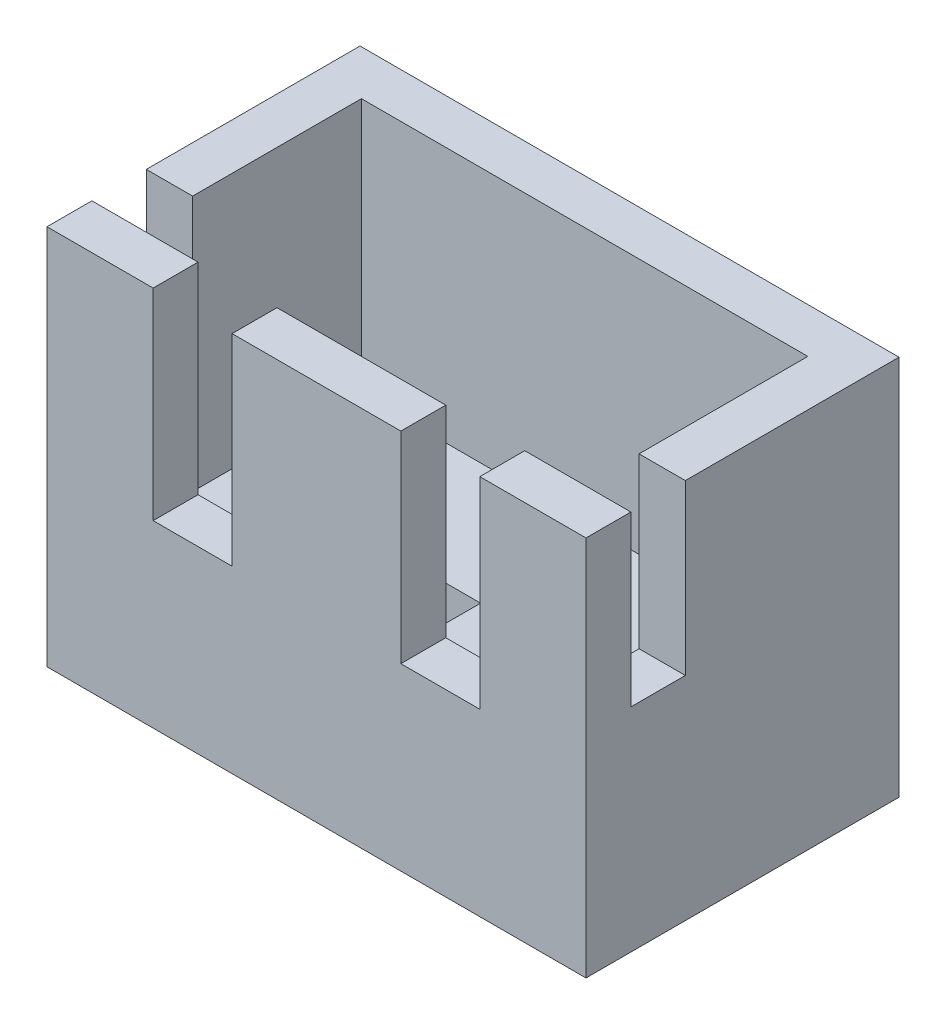
ISO-10303-21;
HEADER;
FILE_DESCRIPTION(('STEP AP214'),'2;1');
FILE_NAME('part.step','',(''),(''),'','','');
FILE_SCHEMA(('AUTOMOTIVE_DESIGN { 1 0 10303 214 1 1 1 1 }'));
ENDSEC;
DATA;
#1=APPLICATION_CONTEXT('core data for automotive mechanical design processes');
#2=APPLICATION_PROTOCOL_DEFINITION('international standard','automotive_design',2000,#1);
#3=PRODUCT_CONTEXT('',#1,'mechanical');
#4=PRODUCT('Part','Part','',(#3));
#5=PRODUCT_RELATED_PRODUCT_CATEGORY('part','',(#4));
#6=PRODUCT_DEFINITION_FORMATION('','',#4);
#7=PRODUCT_DEFINITION_CONTEXT('part definition',#1,'design');
#8=PRODUCT_DEFINITION('design','',#6,#7);
#9=PRODUCT_DEFINITION_SHAPE('','',#8);
#10=(LENGTH_UNIT() NAMED_UNIT(*) SI_UNIT(.MILLI.,.METRE.));
#11=(NAMED_UNIT(*) PLANE_ANGLE_UNIT() SI_UNIT($,.RADIAN.));
#12=(NAMED_UNIT(*) SI_UNIT($,.STERADIAN.) SOLID_ANGLE_UNIT());
#13=UNCERTAINTY_MEASURE_WITH_UNIT(LENGTH_MEASURE(1.E-05),#10,'distance_accuracy_value','');
#14=(GEOMETRIC_REPRESENTATION_CONTEXT(3) GLOBAL_UNCERTAINTY_ASSIGNED_CONTEXT((#13)) GLOBAL_UNIT_ASSIGNED_CONTEXT((#10,
#11,#12)) REPRESENTATION_CONTEXT('',''));
#15=CARTESIAN_POINT('',(0.,0.,0.));
#16=DIRECTION('',(0.,0.,1.));
#17=DIRECTION('',(1.,0.,0.));
#18=AXIS2_PLACEMENT_3D('',#15,#16,#17);
#19=CARTESIAN_POINT('',(2.82,-3.4,0.82));
#20=DIRECTION('',(1.,0.,0.));
#21=DIRECTION('',(0.,1.,0.));
#22=AXIS2_PLACEMENT_3D('',#19,#20,#21);
#23=PLANE('',#22);
#24=DIRECTION('',(0.,1.,0.));
#25=VECTOR('',#24,1.);
#26=CARTESIAN_POINT('',(2.82,-3.4,0.18));
#27=LINE('',#26,#25);
#28=CARTESIAN_POINT('',(2.82,0.,0.18));
#29=VERTEX_POINT('',#28);
#30=CARTESIAN_POINT('',(2.82,2.3,0.18));
#31=VERTEX_POINT('',#30);
#32=EDGE_CURVE('E11',#29,#31,#27,.T.);
#33=ORIENTED_EDGE('',*,*,#32,.F.);
#34=DIRECTION('',(0.,0.,-1.));
#35=VECTOR('',#34,1.);
#36=CARTESIAN_POINT('',(2.82,0.,0.82));
#37=LINE('',#36,#35);
#38=CARTESIAN_POINT('',(2.82,0.,0.82));
#39=VERTEX_POINT('',#38);
#40=EDGE_CURVE('E461',#39,#29,#37,.T.);
#41=ORIENTED_EDGE('',*,*,#40,.F.);
#42=DIRECTION('',(0.,1.,0.));
#43=VECTOR('',#42,1.);
#44=CARTESIAN_POINT('',(2.82,-3.4,0.82));
#45=LINE('',#44,#43);
#46=CARTESIAN_POINT('',(2.82,2.3,0.82));
#47=VERTEX_POINT('',#46);
#48=EDGE_CURVE('E681',#39,#47,#45,.T.);
#49=ORIENTED_EDGE('',*,*,#48,.T.);
#50=DIRECTION('',(0.,0.,1.));
#51=VECTOR('',#50,1.);
#52=CARTESIAN_POINT('',(2.82,2.3,0.82));
#53=LINE('',#52,#51);
#54=EDGE_CURVE('E637',#31,#47,#53,.T.);
#55=ORIENTED_EDGE('',*,*,#54,.F.);
#56=EDGE_LOOP('',(#33,#41,#49,#55));
#57=FACE_BOUND('',#56,.T.);
#58=ADVANCED_FACE('F17',(#57),#23,.F.);
#59=CARTESIAN_POINT('',(2.82,-3.4,0.18));
#60=DIRECTION('',(0.,0.,-1.));
#61=DIRECTION('',(-1.,0.,0.));
#62=AXIS2_PLACEMENT_3D('',#59,#60,#61);
#63=PLANE('',#62);
#64=DIRECTION('',(0.,1.,0.));
#65=VECTOR('',#64,1.);
#66=CARTESIAN_POINT('',(2.18,-3.4,0.18));
#67=LINE('',#66,#65);
#68=CARTESIAN_POINT('',(2.18,0.,0.18));
#69=VERTEX_POINT('',#68);
#70=CARTESIAN_POINT('',(2.18,2.3,0.18));
#71=VERTEX_POINT('',#70);
#72=EDGE_CURVE('E26',#69,#71,#67,.T.);
#73=ORIENTED_EDGE('',*,*,#72,.F.);
#74=DIRECTION('',(1.,0.,0.));
#75=VECTOR('',#74,1.);
#76=CARTESIAN_POINT('',(4.95,0.,0.18));
#77=LINE('',#76,#75);
#78=EDGE_CURVE('E380',#69,#29,#77,.T.);
#79=ORIENTED_EDGE('',*,*,#78,.T.);
#80=ORIENTED_EDGE('',*,*,#32,.T.);
#81=DIRECTION('',(-1.,0.,0.));
#82=VECTOR('',#81,1.);
#83=CARTESIAN_POINT('',(-4.1,2.3,0.18));
#84=LINE('',#83,#82);
#85=EDGE_CURVE('E415',#31,#71,#84,.T.);
#86=ORIENTED_EDGE('',*,*,#85,.T.);
#87=EDGE_LOOP('',(#73,#79,#80,#86));
#88=FACE_BOUND('',#87,.T.);
#89=ADVANCED_FACE('F705',(#88),#63,.F.);
#90=CARTESIAN_POINT('',(2.18,-3.4,0.18));
#91=DIRECTION('',(-1.,0.,0.));
#92=DIRECTION('',(0.,0.,1.));
#93=AXIS2_PLACEMENT_3D('',#90,#91,#92);
#94=PLANE('',#93);
#95=DIRECTION('',(0.,1.,0.));
#96=VECTOR('',#95,1.);
#97=CARTESIAN_POINT('',(2.18,-3.4,0.82));
#98=LINE('',#97,#96);
#99=CARTESIAN_POINT('',(2.18,0.,0.82));
#100=VERTEX_POINT('',#99);
#101=CARTESIAN_POINT('',(2.18,2.3,0.82));
#102=VERTEX_POINT('',#101);
#103=EDGE_CURVE('E20',#100,#102,#98,.T.);
#104=ORIENTED_EDGE('',*,*,#103,.F.);
#105=DIRECTION('',(0.,0.,1.));
#106=VECTOR('',#105,1.);
#107=CARTESIAN_POINT('',(2.18,0.,0.82));
#108=LINE('',#107,#106);
#109=EDGE_CURVE('E508',#69,#100,#108,.T.);
#110=ORIENTED_EDGE('',*,*,#109,.F.);
#111=ORIENTED_EDGE('',*,*,#72,.T.);
#112=DIRECTION('',(0.,0.,-1.));
#113=VECTOR('',#112,1.);
#114=CARTESIAN_POINT('',(2.18,2.3,0.82));
#115=LINE('',#114,#113);
#116=EDGE_CURVE('E411',#102,#71,#115,.T.);
#117=ORIENTED_EDGE('',*,*,#116,.F.);
#118=EDGE_LOOP('',(#104,#110,#111,#117));
#119=FACE_BOUND('',#118,.T.);
#120=ADVANCED_FACE('F698',(#119),#94,.F.);
#121=CARTESIAN_POINT('',(2.18,-3.4,0.82));
#122=DIRECTION('',(0.,0.,1.));
#123=DIRECTION('',(1.,0.,0.));
#124=AXIS2_PLACEMENT_3D('',#121,#122,#123);
#125=PLANE('',#124);
#126=ORIENTED_EDGE('',*,*,#48,.F.);
#127=DIRECTION('',(1.,0.,0.));
#128=VECTOR('',#127,1.);
#129=CARTESIAN_POINT('',(2.18,0.,0.82));
#130=LINE('',#129,#128);
#131=EDGE_CURVE('E465',#100,#39,#130,.T.);
#132=ORIENTED_EDGE('',*,*,#131,.F.);
#133=ORIENTED_EDGE('',*,*,#103,.T.);
#134=DIRECTION('',(-1.,0.,0.));
#135=VECTOR('',#134,1.);
#136=CARTESIAN_POINT('',(2.18,2.3,0.82));
#137=LINE('',#136,#135);
#138=EDGE_CURVE('E416',#47,#102,#137,.T.);
#139=ORIENTED_EDGE('',*,*,#138,.F.);
#140=EDGE_LOOP('',(#126,#132,#133,#139));
#141=FACE_BOUND('',#140,.T.);
#142=ADVANCED_FACE('F695',(#141),#125,.F.);
#143=CARTESIAN_POINT('',(0.32,-3.4,0.82));
#144=DIRECTION('',(1.,0.,0.));
#145=DIRECTION('',(0.,0.,1.));
#146=AXIS2_PLACEMENT_3D('',#143,#144,#145);
#147=PLANE('',#146);
#148=DIRECTION('',(0.,1.,0.));
#149=VECTOR('',#148,1.);
#150=CARTESIAN_POINT('',(0.32,-3.4,0.18));
#151=LINE('',#150,#149);
#152=CARTESIAN_POINT('',(0.32,0.,0.18));
#153=VERTEX_POINT('',#152);
#154=CARTESIAN_POINT('',(0.32,2.3,0.18));
#155=VERTEX_POINT('',#154);
#156=EDGE_CURVE('E679',#153,#155,#151,.T.);
#157=ORIENTED_EDGE('',*,*,#156,.F.);
#158=DIRECTION('',(0.,0.,-1.));
#159=VECTOR('',#158,1.);
#160=CARTESIAN_POINT('',(0.32,0.,0.82));
#161=LINE('',#160,#159);
#162=CARTESIAN_POINT('',(0.32,0.,0.82));
#163=VERTEX_POINT('',#162);
#164=EDGE_CURVE('E530',#163,#153,#161,.T.);
#165=ORIENTED_EDGE('',*,*,#164,.F.);
#166=DIRECTION('',(0.,1.,0.));
#167=VECTOR('',#166,1.);
#168=CARTESIAN_POINT('',(0.32,-3.4,0.82));
#169=LINE('',#168,#167);
#170=CARTESIAN_POINT('',(0.32,2.3,0.82));
#171=VERTEX_POINT('',#170);
#172=EDGE_CURVE('E439',#163,#171,#169,.T.);
#173=ORIENTED_EDGE('',*,*,#172,.T.);
#174=DIRECTION('',(0.,0.,1.));
#175=VECTOR('',#174,1.);
#176=CARTESIAN_POINT('',(0.32,2.3,0.82));
#177=LINE('',#176,#175);
#178=EDGE_CURVE('E649',#155,#171,#177,.T.);
#179=ORIENTED_EDGE('',*,*,#178,.F.);
#180=EDGE_LOOP('',(#157,#165,#173,#179));
#181=FACE_BOUND('',#180,.T.);
#182=ADVANCED_FACE('F1074',(#181),#147,.F.);
#183=CARTESIAN_POINT('',(0.32,-3.4,0.18));
#184=DIRECTION('',(0.,0.,-1.));
#185=DIRECTION('',(-1.,0.,0.));
#186=AXIS2_PLACEMENT_3D('',#183,#184,#185);
#187=PLANE('',#186);
#188=DIRECTION('',(0.,1.,0.));
#189=VECTOR('',#188,1.);
#190=CARTESIAN_POINT('',(-0.32,-3.4,0.18));
#191=LINE('',#190,#189);
#192=CARTESIAN_POINT('',(-0.32,0.,0.18));
#193=VERTEX_POINT('',#192);
#194=CARTESIAN_POINT('',(-0.32,2.3,0.18));
#195=VERTEX_POINT('',#194);
#196=EDGE_CURVE('E39',#193,#195,#191,.T.);
#197=ORIENTED_EDGE('',*,*,#196,.F.);
#198=DIRECTION('',(1.,0.,0.));
#199=VECTOR('',#198,1.);
#200=CARTESIAN_POINT('',(4.95,0.,0.18));
#201=LINE('',#200,#199);
#202=EDGE_CURVE('E534',#193,#153,#201,.T.);
#203=ORIENTED_EDGE('',*,*,#202,.T.);
#204=ORIENTED_EDGE('',*,*,#156,.T.);
#205=DIRECTION('',(-1.,0.,0.));
#206=VECTOR('',#205,1.);
#207=CARTESIAN_POINT('',(-4.1,2.3,0.18));
#208=LINE('',#207,#206);
#209=EDGE_CURVE('E546',#155,#195,#208,.T.);
#210=ORIENTED_EDGE('',*,*,#209,.T.);
#211=EDGE_LOOP('',(#197,#203,#204,#210));
#212=FACE_BOUND('',#211,.T.);
#213=ADVANCED_FACE('F1071',(#212),#187,.F.);
#214=CARTESIAN_POINT('',(-0.32,-3.4,0.18));
#215=DIRECTION('',(-1.,0.,0.));
#216=DIRECTION('',(0.,0.,1.));
#217=AXIS2_PLACEMENT_3D('',#214,#215,#216);
#218=PLANE('',#217);
#219=DIRECTION('',(0.,1.,0.));
#220=VECTOR('',#219,1.);
#221=CARTESIAN_POINT('',(-0.32,-3.4,0.82));
#222=LINE('',#221,#220);
#223=CARTESIAN_POINT('',(-0.32,0.,0.82));
#224=VERTEX_POINT('',#223);
#225=CARTESIAN_POINT('',(-0.32,2.3,0.82));
#226=VERTEX_POINT('',#225);
#227=EDGE_CURVE('E49',#224,#226,#222,.T.);
#228=ORIENTED_EDGE('',*,*,#227,.F.);
#229=DIRECTION('',(0.,0.,1.));
#230=VECTOR('',#229,1.);
#231=CARTESIAN_POINT('',(-0.32,0.,0.82));
#232=LINE('',#231,#230);
#233=EDGE_CURVE('E379',#193,#224,#232,.T.);
#234=ORIENTED_EDGE('',*,*,#233,.F.);
#235=ORIENTED_EDGE('',*,*,#196,.T.);
#236=DIRECTION('',(0.,0.,-1.));
#237=VECTOR('',#236,1.);
#238=CARTESIAN_POINT('',(-0.32,2.3,0.82));
#239=LINE('',#238,#237);
#240=EDGE_CURVE('E542',#226,#195,#239,.T.);
#241=ORIENTED_EDGE('',*,*,#240,.F.);
#242=EDGE_LOOP('',(#228,#234,#235,#241));
#243=FACE_BOUND('',#242,.T.);
#244=ADVANCED_FACE('F1007',(#243),#218,.F.);
#245=CARTESIAN_POINT('',(-0.32,-3.4,0.82));
#246=DIRECTION('',(0.,0.,1.));
#247=DIRECTION('',(1.,0.,0.));
#248=AXIS2_PLACEMENT_3D('',#245,#246,#247);
#249=PLANE('',#248);
#250=ORIENTED_EDGE('',*,*,#172,.F.);
#251=DIRECTION('',(1.,0.,0.));
#252=VECTOR('',#251,1.);
#253=CARTESIAN_POINT('',(-0.32,0.,0.82));
#254=LINE('',#253,#252);
#255=EDGE_CURVE('E526',#224,#163,#254,.T.);
#256=ORIENTED_EDGE('',*,*,#255,.F.);
#257=ORIENTED_EDGE('',*,*,#227,.T.);
#258=DIRECTION('',(-1.,0.,0.));
#259=VECTOR('',#258,1.);
#260=CARTESIAN_POINT('',(-0.32,2.3,0.82));
#261=LINE('',#260,#259);
#262=EDGE_CURVE('E547',#171,#226,#261,.T.);
#263=ORIENTED_EDGE('',*,*,#262,.F.);
#264=EDGE_LOOP('',(#250,#256,#257,#263));
#265=FACE_BOUND('',#264,.T.);
#266=ADVANCED_FACE('F999',(#265),#249,.F.);
#267=CARTESIAN_POINT('',(-2.18,-3.4,0.82));
#268=DIRECTION('',(1.,0.,0.));
#269=DIRECTION('',(0.,0.,1.));
#270=AXIS2_PLACEMENT_3D('',#267,#268,#269);
#271=PLANE('',#270);
#272=DIRECTION('',(0.,1.,0.));
#273=VECTOR('',#272,1.);
#274=CARTESIAN_POINT('',(-2.18,-3.4,0.18));
#275=LINE('',#274,#273);
#276=CARTESIAN_POINT('',(-2.18,0.,0.18));
#277=VERTEX_POINT('',#276);
#278=CARTESIAN_POINT('',(-2.18,2.3,0.18));
#279=VERTEX_POINT('',#278);
#280=EDGE_CURVE('E450',#277,#279,#275,.T.);
#281=ORIENTED_EDGE('',*,*,#280,.F.);
#282=DIRECTION('',(0.,0.,-1.));
#283=VECTOR('',#282,1.);
#284=CARTESIAN_POINT('',(-2.18,0.,0.82));
#285=LINE('',#284,#283);
#286=CARTESIAN_POINT('',(-2.18,0.,0.82));
#287=VERTEX_POINT('',#286);
#288=EDGE_CURVE('E491',#287,#277,#285,.T.);
#289=ORIENTED_EDGE('',*,*,#288,.F.);
#290=DIRECTION('',(0.,1.,0.));
#291=VECTOR('',#290,1.);
#292=CARTESIAN_POINT('',(-2.18,-3.4,0.82));
#293=LINE('',#292,#291);
#294=CARTESIAN_POINT('',(-2.18,2.3,0.82));
#295=VERTEX_POINT('',#294);
#296=EDGE_CURVE('E560',#287,#295,#293,.T.);
#297=ORIENTED_EDGE('',*,*,#296,.T.);
#298=DIRECTION('',(0.,0.,1.));
#299=VECTOR('',#298,1.);
#300=CARTESIAN_POINT('',(-2.18,2.3,0.82));
#301=LINE('',#300,#299);
#302=EDGE_CURVE('E358',#279,#295,#301,.T.);
#303=ORIENTED_EDGE('',*,*,#302,.F.);
#304=EDGE_LOOP('',(#281,#289,#297,#303));
#305=FACE_BOUND('',#304,.T.);
#306=ADVANCED_FACE('F997',(#305),#271,.F.);
#307=CARTESIAN_POINT('',(-2.18,-3.4,0.18));
#308=DIRECTION('',(0.,0.,-1.));
#309=DIRECTION('',(-1.,0.,0.));
#310=AXIS2_PLACEMENT_3D('',#307,#308,#309);
#311=PLANE('',#310);
#312=DIRECTION('',(0.,1.,0.));
#313=VECTOR('',#312,1.);
#314=CARTESIAN_POINT('',(-2.82,-3.4,0.18));
#315=LINE('',#314,#313);
#316=CARTESIAN_POINT('',(-2.82,0.,0.18));
#317=VERTEX_POINT('',#316);
#318=CARTESIAN_POINT('',(-2.82,2.3,0.18));
#319=VERTEX_POINT('',#318);
#320=EDGE_CURVE('E559',#317,#319,#315,.T.);
#321=ORIENTED_EDGE('',*,*,#320,.F.);
#322=DIRECTION('',(1.,0.,0.));
#323=VECTOR('',#322,1.);
#324=CARTESIAN_POINT('',(4.95,0.,0.18));
#325=LINE('',#324,#323);
#326=EDGE_CURVE('E504',#317,#277,#325,.T.);
#327=ORIENTED_EDGE('',*,*,#326,.T.);
#328=ORIENTED_EDGE('',*,*,#280,.T.);
#329=DIRECTION('',(-1.,0.,0.));
#330=VECTOR('',#329,1.);
#331=CARTESIAN_POINT('',(-4.1,2.3,0.18));
#332=LINE('',#331,#330);
#333=EDGE_CURVE('E601',#279,#319,#332,.T.);
#334=ORIENTED_EDGE('',*,*,#333,.T.);
#335=EDGE_LOOP('',(#321,#327,#328,#334));
#336=FACE_BOUND('',#335,.T.);
#337=ADVANCED_FACE('F988',(#336),#311,.F.);
#338=CARTESIAN_POINT('',(-2.82,-3.4,0.18));
#339=DIRECTION('',(-1.,0.,0.));
#340=DIRECTION('',(0.,0.,1.));
#341=AXIS2_PLACEMENT_3D('',#338,#339,#340);
#342=PLANE('',#341);
#343=DIRECTION('',(0.,1.,0.));
#344=VECTOR('',#343,1.);
#345=CARTESIAN_POINT('',(-2.82,-3.4,0.82));
#346=LINE('',#345,#344);
#347=CARTESIAN_POINT('',(-2.82,0.,0.82));
#348=VERTEX_POINT('',#347);
#349=CARTESIAN_POINT('',(-2.82,2.3,0.82));
#350=VERTEX_POINT('',#349);
#351=EDGE_CURVE('E556',#348,#350,#346,.T.);
#352=ORIENTED_EDGE('',*,*,#351,.F.);
#353=DIRECTION('',(0.,0.,1.));
#354=VECTOR('',#353,1.);
#355=CARTESIAN_POINT('',(-2.82,0.,0.82));
#356=LINE('',#355,#354);
#357=EDGE_CURVE('E353',#317,#348,#356,.T.);
#358=ORIENTED_EDGE('',*,*,#357,.F.);
#359=ORIENTED_EDGE('',*,*,#320,.T.);
#360=DIRECTION('',(0.,0.,-1.));
#361=VECTOR('',#360,1.);
#362=CARTESIAN_POINT('',(-2.82,2.3,0.82));
#363=LINE('',#362,#361);
#364=EDGE_CURVE('E597',#350,#319,#363,.T.);
#365=ORIENTED_EDGE('',*,*,#364,.F.);
#366=EDGE_LOOP('',(#352,#358,#359,#365));
#367=FACE_BOUND('',#366,.T.);
#368=ADVANCED_FACE('F992',(#367),#342,.F.);
#369=CARTESIAN_POINT('',(-2.82,-3.4,0.82));
#370=DIRECTION('',(0.,0.,1.));
#371=DIRECTION('',(1.,0.,0.));
#372=AXIS2_PLACEMENT_3D('',#369,#370,#371);
#373=PLANE('',#372);
#374=ORIENTED_EDGE('',*,*,#296,.F.);
#375=DIRECTION('',(1.,0.,0.));
#376=VECTOR('',#375,1.);
#377=CARTESIAN_POINT('',(-2.82,0.,0.82));
#378=LINE('',#377,#376);
#379=EDGE_CURVE('E487',#348,#287,#378,.T.);
#380=ORIENTED_EDGE('',*,*,#379,.F.);
#381=ORIENTED_EDGE('',*,*,#351,.T.);
#382=DIRECTION('',(-1.,0.,0.));
#383=VECTOR('',#382,1.);
#384=CARTESIAN_POINT('',(-2.82,2.3,0.82));
#385=LINE('',#384,#383);
#386=EDGE_CURVE('E602',#295,#350,#385,.T.);
#387=ORIENTED_EDGE('',*,*,#386,.F.);
#388=EDGE_LOOP('',(#374,#380,#381,#387));
#389=FACE_BOUND('',#388,.T.);
#390=ADVANCED_FACE('F994',(#389),#373,.F.);
#391=CARTESIAN_POINT('',(1.55,7.,-1.923977856003));
#392=DIRECTION('',(-1.,0.,0.));
#393=DIRECTION('',(0.,0.,1.));
#394=AXIS2_PLACEMENT_3D('',#391,#392,#393);
#395=PLANE('',#394);
#396=DIRECTION('',(0.,0.,1.));
#397=VECTOR('',#396,1.);
#398=CARTESIAN_POINT('',(1.55,7.,2.875));
#399=LINE('',#398,#397);
#400=CARTESIAN_POINT('',(1.55,7.,2.05));
#401=VERTEX_POINT('',#400);
#402=CARTESIAN_POINT('',(1.55,7.,2.875));
#403=VERTEX_POINT('',#402);
#404=EDGE_CURVE('E670',#401,#403,#399,.T.);
#405=ORIENTED_EDGE('',*,*,#404,.T.);
#406=DIRECTION('',(0.,-1.,0.));
#407=VECTOR('',#406,1.);
#408=CARTESIAN_POINT('',(1.55,0.,2.875));
#409=LINE('',#408,#407);
#410=CARTESIAN_POINT('',(1.55,3.3,2.875));
#411=VERTEX_POINT('',#410);
#412=EDGE_CURVE('E434',#403,#411,#409,.T.);
#413=ORIENTED_EDGE('',*,*,#412,.T.);
#414=DIRECTION('',(0.,0.,-1.));
#415=VECTOR('',#414,1.);
#416=CARTESIAN_POINT('',(1.55,3.3,-1.923977856003));
#417=LINE('',#416,#415);
#418=CARTESIAN_POINT('',(1.55,3.3,2.05));
#419=VERTEX_POINT('',#418);
#420=EDGE_CURVE('E361',#411,#419,#417,.T.);
#421=ORIENTED_EDGE('',*,*,#420,.T.);
#422=DIRECTION('',(0.,1.,0.));
#423=VECTOR('',#422,1.);
#424=CARTESIAN_POINT('',(1.55,7.,2.05));
#425=LINE('',#424,#423);
#426=EDGE_CURVE('E564',#419,#401,#425,.T.);
#427=ORIENTED_EDGE('',*,*,#426,.T.);
#428=EDGE_LOOP('',(#405,#413,#421,#427));
#429=FACE_BOUND('',#428,.T.);
#430=ADVANCED_FACE('F1059',(#429),#395,.F.);
#431=CARTESIAN_POINT('',(4.95,7.,2.875));
#432=DIRECTION('',(0.,-1.,0.));
#433=DIRECTION('',(0.,0.,-1.));
#434=AXIS2_PLACEMENT_3D('',#431,#432,#433);
#435=PLANE('',#434);
#436=ORIENTED_EDGE('',*,*,#404,.F.);
#437=DIRECTION('',(-1.,0.,0.));
#438=VECTOR('',#437,1.);
#439=CARTESIAN_POINT('',(4.95,7.,2.05));
#440=LINE('',#439,#438);
#441=CARTESIAN_POINT('',(-1.55,7.,2.05));
#442=VERTEX_POINT('',#441);
#443=EDGE_CURVE('E596',#401,#442,#440,.T.);
#444=ORIENTED_EDGE('',*,*,#443,.T.);
#445=DIRECTION('',(0.,0.,1.));
#446=VECTOR('',#445,1.);
#447=CARTESIAN_POINT('',(-1.55,7.,-1.923977856003));
#448=LINE('',#447,#446);
#449=CARTESIAN_POINT('',(-1.55,7.,2.875));
#450=VERTEX_POINT('',#449);
#451=EDGE_CURVE('E667',#442,#450,#448,.T.);
#452=ORIENTED_EDGE('',*,*,#451,.T.);
#453=DIRECTION('',(1.,0.,0.));
#454=VECTOR('',#453,1.);
#455=CARTESIAN_POINT('',(4.95,7.,2.875));
#456=LINE('',#455,#454);
#457=EDGE_CURVE('E429',#450,#403,#456,.T.);
#458=ORIENTED_EDGE('',*,*,#457,.T.);
#459=EDGE_LOOP('',(#436,#444,#452,#458));
#460=FACE_BOUND('',#459,.T.);
#461=ADVANCED_FACE('F1056',(#460),#435,.F.);
#462=CARTESIAN_POINT('',(-1.55,7.,-1.923977856003));
#463=DIRECTION('',(1.,0.,0.));
#464=DIRECTION('',(0.,1.,0.));
#465=AXIS2_PLACEMENT_3D('',#462,#463,#464);
#466=PLANE('',#465);
#467=DIRECTION('',(0.,0.,1.));
#468=VECTOR('',#467,1.);
#469=CARTESIAN_POINT('',(-1.55,3.3,-1.923977856003));
#470=LINE('',#469,#468);
#471=CARTESIAN_POINT('',(-1.55,3.3,2.05));
#472=VERTEX_POINT('',#471);
#473=CARTESIAN_POINT('',(-1.55,3.3,2.875));
#474=VERTEX_POINT('',#473);
#475=EDGE_CURVE('E664',#472,#474,#470,.T.);
#476=ORIENTED_EDGE('',*,*,#475,.T.);
#477=DIRECTION('',(0.,1.,0.));
#478=VECTOR('',#477,1.);
#479=CARTESIAN_POINT('',(-1.55,0.,2.875));
#480=LINE('',#479,#478);
#481=EDGE_CURVE('E433',#474,#450,#480,.T.);
#482=ORIENTED_EDGE('',*,*,#481,.T.);
#483=ORIENTED_EDGE('',*,*,#451,.F.);
#484=DIRECTION('',(0.,-1.,0.));
#485=VECTOR('',#484,1.);
#486=CARTESIAN_POINT('',(-1.55,7.,2.05));
#487=LINE('',#486,#485);
#488=EDGE_CURVE('E592',#442,#472,#487,.T.);
#489=ORIENTED_EDGE('',*,*,#488,.T.);
#490=EDGE_LOOP('',(#476,#482,#483,#489));
#491=FACE_BOUND('',#490,.T.);
#492=ADVANCED_FACE('F1052',(#491),#466,.F.);
#493=CARTESIAN_POINT('',(-3.,3.3,-1.923977856003));
#494=DIRECTION('',(0.,-1.,0.));
#495=DIRECTION('',(0.,0.,-1.));
#496=AXIS2_PLACEMENT_3D('',#493,#494,#495);
#497=PLANE('',#496);
#498=DIRECTION('',(0.,0.,1.));
#499=VECTOR('',#498,1.);
#500=CARTESIAN_POINT('',(-3.,3.3,-1.923977856003));
#501=LINE('',#500,#499);
#502=CARTESIAN_POINT('',(-3.,3.3,2.05));
#503=VERTEX_POINT('',#502);
#504=CARTESIAN_POINT('',(-3.,3.3,2.875));
#505=VERTEX_POINT('',#504);
#506=EDGE_CURVE('E661',#503,#505,#501,.T.);
#507=ORIENTED_EDGE('',*,*,#506,.T.);
#508=DIRECTION('',(1.,0.,0.));
#509=VECTOR('',#508,1.);
#510=CARTESIAN_POINT('',(4.95,3.3,2.875));
#511=LINE('',#510,#509);
#512=EDGE_CURVE('E480',#505,#474,#511,.T.);
#513=ORIENTED_EDGE('',*,*,#512,.T.);
#514=ORIENTED_EDGE('',*,*,#475,.F.);
#515=DIRECTION('',(-1.,0.,0.));
#516=VECTOR('',#515,1.);
#517=CARTESIAN_POINT('',(4.95,3.3,2.05));
#518=LINE('',#517,#516);
#519=EDGE_CURVE('E588',#472,#503,#518,.T.);
#520=ORIENTED_EDGE('',*,*,#519,.T.);
#521=EDGE_LOOP('',(#507,#513,#514,#520));
#522=FACE_BOUND('',#521,.T.);
#523=ADVANCED_FACE('F1048',(#522),#497,.F.);
#524=CARTESIAN_POINT('',(-3.,7.,-1.923977856003));
#525=DIRECTION('',(-1.,0.,0.));
#526=DIRECTION('',(0.,0.,1.));
#527=AXIS2_PLACEMENT_3D('',#524,#525,#526);
#528=PLANE('',#527);
#529=DIRECTION('',(0.,0.,1.));
#530=VECTOR('',#529,1.);
#531=CARTESIAN_POINT('',(-3.,7.,2.875));
#532=LINE('',#531,#530);
#533=CARTESIAN_POINT('',(-3.,7.,2.05));
#534=VERTEX_POINT('',#533);
#535=CARTESIAN_POINT('',(-3.,7.,2.875));
#536=VERTEX_POINT('',#535);
#537=EDGE_CURVE('E658',#534,#536,#532,.T.);
#538=ORIENTED_EDGE('',*,*,#537,.T.);
#539=DIRECTION('',(0.,-1.,0.));
#540=VECTOR('',#539,1.);
#541=CARTESIAN_POINT('',(-3.,0.,2.875));
#542=LINE('',#541,#540);
#543=EDGE_CURVE('E475',#536,#505,#542,.T.);
#544=ORIENTED_EDGE('',*,*,#543,.T.);
#545=ORIENTED_EDGE('',*,*,#506,.F.);
#546=DIRECTION('',(0.,1.,0.));
#547=VECTOR('',#546,1.);
#548=CARTESIAN_POINT('',(-3.,7.,2.05));
#549=LINE('',#548,#547);
#550=EDGE_CURVE('E420',#503,#534,#549,.T.);
#551=ORIENTED_EDGE('',*,*,#550,.T.);
#552=EDGE_LOOP('',(#538,#544,#545,#551));
#553=FACE_BOUND('',#552,.T.);
#554=ADVANCED_FACE('F1044',(#553),#528,.F.);
#555=CARTESIAN_POINT('',(4.95,7.,2.875));
#556=DIRECTION('',(0.,-1.,0.));
#557=DIRECTION('',(0.,0.,-1.));
#558=AXIS2_PLACEMENT_3D('',#555,#556,#557);
#559=PLANE('',#558);
#560=ORIENTED_EDGE('',*,*,#537,.F.);
#561=DIRECTION('',(-1.,0.,0.));
#562=VECTOR('',#561,1.);
#563=CARTESIAN_POINT('',(4.95,7.,2.05));
#564=LINE('',#563,#562);
#565=CARTESIAN_POINT('',(-4.95,7.,2.05));
#566=VERTEX_POINT('',#565);
#567=EDGE_CURVE('E417',#534,#566,#564,.T.);
#568=ORIENTED_EDGE('',*,*,#567,.T.);
#569=DIRECTION('',(0.,0.,-1.));
#570=VECTOR('',#569,1.);
#571=CARTESIAN_POINT('',(-4.95,7.,2.875));
#572=LINE('',#571,#570);
#573=CARTESIAN_POINT('',(-4.95,7.,2.875));
#574=VERTEX_POINT('',#573);
#575=EDGE_CURVE('E393',#574,#566,#572,.T.);
#576=ORIENTED_EDGE('',*,*,#575,.F.);
#577=DIRECTION('',(1.,0.,0.));
#578=VECTOR('',#577,1.);
#579=CARTESIAN_POINT('',(4.95,7.,2.875));
#580=LINE('',#579,#578);
#581=EDGE_CURVE('E470',#574,#536,#580,.T.);
#582=ORIENTED_EDGE('',*,*,#581,.T.);
#583=EDGE_LOOP('',(#560,#568,#576,#582));
#584=FACE_BOUND('',#583,.T.);
#585=ADVANCED_FACE('F1040',(#584),#559,.F.);
#586=CARTESIAN_POINT('',(-4.1,2.3,2.05));
#587=DIRECTION('',(0.,-1.,0.));
#588=DIRECTION('',(0.,0.,-1.));
#589=AXIS2_PLACEMENT_3D('',#586,#587,#588);
#590=PLANE('',#589);
#591=ORIENTED_EDGE('',*,*,#178,.T.);
#592=ORIENTED_EDGE('',*,*,#262,.T.);
#593=ORIENTED_EDGE('',*,*,#240,.T.);
#594=ORIENTED_EDGE('',*,*,#209,.F.);
#595=EDGE_LOOP('',(#591,#592,#593,#594));
#596=FACE_BOUND('',#595,.T.);
#597=DIRECTION('',(1.,0.,0.));
#598=VECTOR('',#597,1.);
#599=CARTESIAN_POINT('',(4.95,2.3,2.05));
#600=LINE('',#599,#598);
#601=CARTESIAN_POINT('',(-4.1,2.3,2.05));
#602=VERTEX_POINT('',#601);
#603=CARTESIAN_POINT('',(4.1,2.3,2.05));
#604=VERTEX_POINT('',#603);
#605=EDGE_CURVE('E509',#602,#604,#600,.T.);
#606=ORIENTED_EDGE('',*,*,#605,.T.);
#607=DIRECTION('',(0.,0.,-1.));
#608=VECTOR('',#607,1.);
#609=CARTESIAN_POINT('',(4.1,2.3,2.05));
#610=LINE('',#609,#608);
#611=CARTESIAN_POINT('',(4.1,2.3,-2.05));
#612=VERTEX_POINT('',#611);
#613=EDGE_CURVE('E573',#604,#612,#610,.T.);
#614=ORIENTED_EDGE('',*,*,#613,.T.);
#615=DIRECTION('',(-1.,0.,0.));
#616=VECTOR('',#615,1.);
#617=CARTESIAN_POINT('',(-4.1,2.3,-2.05));
#618=LINE('',#617,#616);
#619=CARTESIAN_POINT('',(-4.1,2.3,-2.05));
#620=VERTEX_POINT('',#619);
#621=EDGE_CURVE('E621',#612,#620,#618,.T.);
#622=ORIENTED_EDGE('',*,*,#621,.T.);
#623=DIRECTION('',(0.,0.,1.));
#624=VECTOR('',#623,1.);
#625=CARTESIAN_POINT('',(-4.1,2.3,2.05));
#626=LINE('',#625,#624);
#627=EDGE_CURVE('E494',#620,#602,#626,.T.);
#628=ORIENTED_EDGE('',*,*,#627,.T.);
#629=EDGE_LOOP('',(#606,#614,#622,#628));
#630=FACE_BOUND('',#629,.T.);
#631=ORIENTED_EDGE('',*,*,#54,.T.);
#632=ORIENTED_EDGE('',*,*,#138,.T.);
#633=ORIENTED_EDGE('',*,*,#116,.T.);
#634=ORIENTED_EDGE('',*,*,#85,.F.);
#635=EDGE_LOOP('',(#631,#632,#633,#634));
#636=FACE_BOUND('',#635,.T.);
#637=ORIENTED_EDGE('',*,*,#302,.T.);
#638=ORIENTED_EDGE('',*,*,#386,.T.);
#639=ORIENTED_EDGE('',*,*,#364,.T.);
#640=ORIENTED_EDGE('',*,*,#333,.F.);
#641=EDGE_LOOP('',(#637,#638,#639,#640));
#642=FACE_BOUND('',#641,.T.);
#643=ADVANCED_FACE('F701',(#596,#630,#636,#642),#590,.F.);
#644=CARTESIAN_POINT('',(4.95,7.,2.875));
#645=DIRECTION('',(0.,-1.,0.));
#646=DIRECTION('',(0.,0.,-1.));
#647=AXIS2_PLACEMENT_3D('',#644,#645,#646);
#648=PLANE('',#647);
#649=DIRECTION('',(0.,0.,1.));
#650=VECTOR('',#649,1.);
#651=CARTESIAN_POINT('',(3.,7.,-1.923977856003));
#652=LINE('',#651,#650);
#653=CARTESIAN_POINT('',(3.,7.,2.05));
#654=VERTEX_POINT('',#653);
#655=CARTESIAN_POINT('',(3.,7.,2.875));
#656=VERTEX_POINT('',#655);
#657=EDGE_CURVE('E355',#654,#656,#652,.T.);
#658=ORIENTED_EDGE('',*,*,#657,.T.);
#659=DIRECTION('',(1.,0.,0.));
#660=VECTOR('',#659,1.);
#661=CARTESIAN_POINT('',(4.95,7.,2.875));
#662=LINE('',#661,#660);
#663=CARTESIAN_POINT('',(4.95,7.,2.875));
#664=VERTEX_POINT('',#663);
#665=EDGE_CURVE('E474',#656,#664,#662,.T.);
#666=ORIENTED_EDGE('',*,*,#665,.T.);
#667=DIRECTION('',(0.,0.,1.));
#668=VECTOR('',#667,1.);
#669=CARTESIAN_POINT('',(4.95,7.,2.875));
#670=LINE('',#669,#668);
#671=CARTESIAN_POINT('',(4.95,7.,2.05));
#672=VERTEX_POINT('',#671);
#673=EDGE_CURVE('E469',#672,#664,#670,.T.);
#674=ORIENTED_EDGE('',*,*,#673,.F.);
#675=DIRECTION('',(-1.,0.,0.));
#676=VECTOR('',#675,1.);
#677=CARTESIAN_POINT('',(4.95,7.,2.05));
#678=LINE('',#677,#676);
#679=EDGE_CURVE('E568',#672,#654,#678,.T.);
#680=ORIENTED_EDGE('',*,*,#679,.T.);
#681=EDGE_LOOP('',(#658,#666,#674,#680));
#682=FACE_BOUND('',#681,.T.);
#683=ADVANCED_FACE('F1033',(#682),#648,.F.);
#684=CARTESIAN_POINT('',(3.,7.,-1.923977856003));
#685=DIRECTION('',(1.,0.,0.));
#686=DIRECTION('',(0.,1.,0.));
#687=AXIS2_PLACEMENT_3D('',#684,#685,#686);
#688=PLANE('',#687);
#689=DIRECTION('',(0.,0.,1.));
#690=VECTOR('',#689,1.);
#691=CARTESIAN_POINT('',(3.,3.3,-1.923977856003));
#692=LINE('',#691,#690);
#693=CARTESIAN_POINT('',(3.,3.3,2.05));
#694=VERTEX_POINT('',#693);
#695=CARTESIAN_POINT('',(3.,3.3,2.875));
#696=VERTEX_POINT('',#695);
#697=EDGE_CURVE('E359',#694,#696,#692,.T.);
#698=ORIENTED_EDGE('',*,*,#697,.T.);
#699=DIRECTION('',(0.,1.,0.));
#700=VECTOR('',#699,1.);
#701=CARTESIAN_POINT('',(3.,0.,2.875));
#702=LINE('',#701,#700);
#703=EDGE_CURVE('E495',#696,#656,#702,.T.);
#704=ORIENTED_EDGE('',*,*,#703,.T.);
#705=ORIENTED_EDGE('',*,*,#657,.F.);
#706=DIRECTION('',(0.,-1.,0.));
#707=VECTOR('',#706,1.);
#708=CARTESIAN_POINT('',(3.,7.,2.05));
#709=LINE('',#708,#707);
#710=EDGE_CURVE('E537',#654,#694,#709,.T.);
#711=ORIENTED_EDGE('',*,*,#710,.T.);
#712=EDGE_LOOP('',(#698,#704,#705,#711));
#713=FACE_BOUND('',#712,.T.);
#714=ADVANCED_FACE('F1029',(#713),#688,.F.);
#715=CARTESIAN_POINT('',(3.,3.3,-1.923977856003));
#716=DIRECTION('',(0.,-1.,0.));
#717=DIRECTION('',(0.,0.,-1.));
#718=AXIS2_PLACEMENT_3D('',#715,#716,#717);
#719=PLANE('',#718);
#720=ORIENTED_EDGE('',*,*,#420,.F.);
#721=DIRECTION('',(1.,0.,0.));
#722=VECTOR('',#721,1.);
#723=CARTESIAN_POINT('',(4.95,3.3,2.875));
#724=LINE('',#723,#722);
#725=EDGE_CURVE('E499',#411,#696,#724,.T.);
#726=ORIENTED_EDGE('',*,*,#725,.T.);
#727=ORIENTED_EDGE('',*,*,#697,.F.);
#728=DIRECTION('',(-1.,0.,0.));
#729=VECTOR('',#728,1.);
#730=CARTESIAN_POINT('',(4.95,3.3,2.05));
#731=LINE('',#730,#729);
#732=EDGE_CURVE('E500',#694,#419,#731,.T.);
#733=ORIENTED_EDGE('',*,*,#732,.T.);
#734=EDGE_LOOP('',(#720,#726,#727,#733));
#735=FACE_BOUND('',#734,.T.);
#736=ADVANCED_FACE('F1024',(#735),#719,.F.);
#737=CARTESIAN_POINT('',(4.95,3.9,2.05));
#738=DIRECTION('',(0.,-1.,0.));
#739=DIRECTION('',(0.,0.,-1.));
#740=AXIS2_PLACEMENT_3D('',#737,#738,#739);
#741=PLANE('',#740);
#742=DIRECTION('',(0.,0.,1.));
#743=VECTOR('',#742,1.);
#744=CARTESIAN_POINT('',(4.1,3.9,2.05));
#745=LINE('',#744,#743);
#746=CARTESIAN_POINT('',(4.1,3.9,1.05));
#747=VERTEX_POINT('',#746);
#748=CARTESIAN_POINT('',(4.1,3.9,2.05));
#749=VERTEX_POINT('',#748);
#750=EDGE_CURVE('E368',#747,#749,#745,.T.);
#751=ORIENTED_EDGE('',*,*,#750,.T.);
#752=DIRECTION('',(1.,0.,0.));
#753=VECTOR('',#752,1.);
#754=CARTESIAN_POINT('',(4.95,3.9,2.05));
#755=LINE('',#754,#753);
#756=CARTESIAN_POINT('',(4.95,3.9,2.05));
#757=VERTEX_POINT('',#756);
#758=EDGE_CURVE('E572',#749,#757,#755,.T.);
#759=ORIENTED_EDGE('',*,*,#758,.T.);
#760=DIRECTION('',(0.,0.,-1.));
#761=VECTOR('',#760,1.);
#762=CARTESIAN_POINT('',(4.95,3.9,2.875));
#763=LINE('',#762,#761);
#764=CARTESIAN_POINT('',(4.95,3.9,1.05));
#765=VERTEX_POINT('',#764);
#766=EDGE_CURVE('E456',#757,#765,#763,.T.);
#767=ORIENTED_EDGE('',*,*,#766,.T.);
#768=DIRECTION('',(-1.,0.,0.));
#769=VECTOR('',#768,1.);
#770=CARTESIAN_POINT('',(4.95,3.9,1.05));
#771=LINE('',#770,#769);
#772=EDGE_CURVE('E367',#765,#747,#771,.T.);
#773=ORIENTED_EDGE('',*,*,#772,.T.);
#774=EDGE_LOOP('',(#751,#759,#767,#773));
#775=FACE_BOUND('',#774,.T.);
#776=ADVANCED_FACE('F1022',(#775),#741,.F.);
#777=CARTESIAN_POINT('',(4.95,3.9,1.05));
#778=DIRECTION('',(0.,0.,-1.));
#779=DIRECTION('',(0.,-1.,0.));
#780=AXIS2_PLACEMENT_3D('',#777,#778,#779);
#781=PLANE('',#780);
#782=DIRECTION('',(0.,-1.,0.));
#783=VECTOR('',#782,1.);
#784=CARTESIAN_POINT('',(4.1,2.3,1.05));
#785=LINE('',#784,#783);
#786=CARTESIAN_POINT('',(4.1,7.,1.05));
#787=VERTEX_POINT('',#786);
#788=EDGE_CURVE('E363',#787,#747,#785,.T.);
#789=ORIENTED_EDGE('',*,*,#788,.T.);
#790=ORIENTED_EDGE('',*,*,#772,.F.);
#791=DIRECTION('',(0.,1.,0.));
#792=VECTOR('',#791,1.);
#793=CARTESIAN_POINT('',(4.95,7.,1.05));
#794=LINE('',#793,#792);
#795=CARTESIAN_POINT('',(4.95,7.,1.05));
#796=VERTEX_POINT('',#795);
#797=EDGE_CURVE('E453',#765,#796,#794,.T.);
#798=ORIENTED_EDGE('',*,*,#797,.T.);
#799=DIRECTION('',(1.,0.,0.));
#800=VECTOR('',#799,1.);
#801=CARTESIAN_POINT('',(4.95,7.,1.05));
#802=LINE('',#801,#800);
#803=EDGE_CURVE('E324',#787,#796,#802,.T.);
#804=ORIENTED_EDGE('',*,*,#803,.F.);
#805=EDGE_LOOP('',(#789,#790,#798,#804));
#806=FACE_BOUND('',#805,.T.);
#807=ADVANCED_FACE('F1020',(#806),#781,.F.);
#808=CARTESIAN_POINT('',(4.1,2.3,2.05));
#809=DIRECTION('',(1.,0.,0.));
#810=DIRECTION('',(0.,0.,-1.));
#811=AXIS2_PLACEMENT_3D('',#808,#809,#810);
#812=PLANE('',#811);
#813=DIRECTION('',(0.,-1.,0.));
#814=VECTOR('',#813,1.);
#815=CARTESIAN_POINT('',(4.1,2.3,-2.05));
#816=LINE('',#815,#814);
#817=CARTESIAN_POINT('',(4.1,7.,-2.05));
#818=VERTEX_POINT('',#817);
#819=EDGE_CURVE('E576',#818,#612,#816,.T.);
#820=ORIENTED_EDGE('',*,*,#819,.T.);
#821=ORIENTED_EDGE('',*,*,#613,.F.);
#822=DIRECTION('',(0.,1.,0.));
#823=VECTOR('',#822,1.);
#824=CARTESIAN_POINT('',(4.1,7.,2.05));
#825=LINE('',#824,#823);
#826=EDGE_CURVE('E513',#604,#749,#825,.T.);
#827=ORIENTED_EDGE('',*,*,#826,.T.);
#828=ORIENTED_EDGE('',*,*,#750,.F.);
#829=ORIENTED_EDGE('',*,*,#788,.F.);
#830=DIRECTION('',(0.,0.,-1.));
#831=VECTOR('',#830,1.);
#832=CARTESIAN_POINT('',(4.1,7.,1.05));
#833=LINE('',#832,#831);
#834=EDGE_CURVE('E371',#787,#818,#833,.T.);
#835=ORIENTED_EDGE('',*,*,#834,.T.);
#836=EDGE_LOOP('',(#820,#821,#827,#828,#829,#835));
#837=FACE_BOUND('',#836,.T.);
#838=ADVANCED_FACE('F1223',(#837),#812,.F.);
#839=CARTESIAN_POINT('',(-4.1,2.3,-2.05));
#840=DIRECTION('',(0.,0.,-1.));
#841=DIRECTION('',(-1.,0.,0.));
#842=AXIS2_PLACEMENT_3D('',#839,#840,#841);
#843=PLANE('',#842);
#844=DIRECTION('',(0.,-1.,0.));
#845=VECTOR('',#844,1.);
#846=CARTESIAN_POINT('',(-4.1,2.3,-2.05));
#847=LINE('',#846,#845);
#848=CARTESIAN_POINT('',(-4.1,7.,-2.05));
#849=VERTEX_POINT('',#848);
#850=EDGE_CURVE('E550',#849,#620,#847,.T.);
#851=ORIENTED_EDGE('',*,*,#850,.T.);
#852=ORIENTED_EDGE('',*,*,#621,.F.);
#853=ORIENTED_EDGE('',*,*,#819,.F.);
#854=DIRECTION('',(-1.,0.,0.));
#855=VECTOR('',#854,1.);
#856=CARTESIAN_POINT('',(4.95,7.,-2.05));
#857=LINE('',#856,#855);
#858=EDGE_CURVE('E375',#818,#849,#857,.T.);
#859=ORIENTED_EDGE('',*,*,#858,.T.);
#860=EDGE_LOOP('',(#851,#852,#853,#859));
#861=FACE_BOUND('',#860,.T.);
#862=ADVANCED_FACE('F1233',(#861),#843,.F.);
#863=CARTESIAN_POINT('',(-4.1,2.3,2.05));
#864=DIRECTION('',(-1.,0.,0.));
#865=DIRECTION('',(0.,1.,0.));
#866=AXIS2_PLACEMENT_3D('',#863,#864,#865);
#867=PLANE('',#866);
#868=DIRECTION('',(0.,-1.,0.));
#869=VECTOR('',#868,1.);
#870=CARTESIAN_POINT('',(-4.1,7.,2.05));
#871=LINE('',#870,#869);
#872=CARTESIAN_POINT('',(-4.1,3.9,2.05));
#873=VERTEX_POINT('',#872);
#874=EDGE_CURVE('E421',#873,#602,#871,.T.);
#875=ORIENTED_EDGE('',*,*,#874,.T.);
#876=ORIENTED_EDGE('',*,*,#627,.F.);
#877=ORIENTED_EDGE('',*,*,#850,.F.);
#878=DIRECTION('',(0.,0.,1.));
#879=VECTOR('',#878,1.);
#880=CARTESIAN_POINT('',(-4.1,7.,1.05));
#881=LINE('',#880,#879);
#882=CARTESIAN_POINT('',(-4.1,7.,1.05));
#883=VERTEX_POINT('',#882);
#884=EDGE_CURVE('E410',#849,#883,#881,.T.);
#885=ORIENTED_EDGE('',*,*,#884,.T.);
#886=DIRECTION('',(0.,-1.,0.));
#887=VECTOR('',#886,1.);
#888=CARTESIAN_POINT('',(-4.1,3.9,1.05));
#889=LINE('',#888,#887);
#890=CARTESIAN_POINT('',(-4.1,3.9,1.05));
#891=VERTEX_POINT('',#890);
#892=EDGE_CURVE('E541',#883,#891,#889,.T.);
#893=ORIENTED_EDGE('',*,*,#892,.T.);
#894=DIRECTION('',(0.,0.,1.));
#895=VECTOR('',#894,1.);
#896=CARTESIAN_POINT('',(-4.1,3.9,2.05));
#897=LINE('',#896,#895);
#898=EDGE_CURVE('E440',#891,#873,#897,.T.);
#899=ORIENTED_EDGE('',*,*,#898,.T.);
#900=EDGE_LOOP('',(#875,#876,#877,#885,#893,#899));
#901=FACE_BOUND('',#900,.T.);
#902=ADVANCED_FACE('F1243',(#901),#867,.F.);
#903=CARTESIAN_POINT('',(4.95,0.,2.875));
#904=DIRECTION('',(0.,0.,-1.));
#905=DIRECTION('',(0.,-1.,0.));
#906=AXIS2_PLACEMENT_3D('',#903,#904,#905);
#907=PLANE('',#906);
#908=ORIENTED_EDGE('',*,*,#703,.F.);
#909=ORIENTED_EDGE('',*,*,#725,.F.);
#910=ORIENTED_EDGE('',*,*,#412,.F.);
#911=ORIENTED_EDGE('',*,*,#457,.F.);
#912=ORIENTED_EDGE('',*,*,#481,.F.);
#913=ORIENTED_EDGE('',*,*,#512,.F.);
#914=ORIENTED_EDGE('',*,*,#543,.F.);
#915=ORIENTED_EDGE('',*,*,#581,.F.);
#916=DIRECTION('',(0.,1.,0.));
#917=VECTOR('',#916,1.);
#918=CARTESIAN_POINT('',(-4.95,7.,2.875));
#919=LINE('',#918,#917);
#920=CARTESIAN_POINT('',(-4.95,0.,2.875));
#921=VERTEX_POINT('',#920);
#922=EDGE_CURVE('E385',#921,#574,#919,.T.);
#923=ORIENTED_EDGE('',*,*,#922,.F.);
#924=DIRECTION('',(1.,0.,0.));
#925=VECTOR('',#924,1.);
#926=CARTESIAN_POINT('',(4.95,0.,2.875));
#927=LINE('',#926,#925);
#928=CARTESIAN_POINT('',(4.95,0.,2.875));
#929=VERTEX_POINT('',#928);
#930=EDGE_CURVE('E376',#921,#929,#927,.T.);
#931=ORIENTED_EDGE('',*,*,#930,.T.);
#932=DIRECTION('',(0.,1.,0.));
#933=VECTOR('',#932,1.);
#934=CARTESIAN_POINT('',(4.95,7.,2.875));
#935=LINE('',#934,#933);
#936=EDGE_CURVE('E479',#929,#664,#935,.T.);
#937=ORIENTED_EDGE('',*,*,#936,.T.);
#938=ORIENTED_EDGE('',*,*,#665,.F.);
#939=EDGE_LOOP('',(#908,#909,#910,#911,#912,#913,#914,#915,#923,#931,#937,#938));
#940=FACE_BOUND('',#939,.T.);
#941=ADVANCED_FACE('F1254',(#940),#907,.F.);
#942=CARTESIAN_POINT('',(4.95,7.,2.05));
#943=DIRECTION('',(0.,0.,1.));
#944=DIRECTION('',(0.,-1.,0.));
#945=AXIS2_PLACEMENT_3D('',#942,#943,#944);
#946=PLANE('',#945);
#947=ORIENTED_EDGE('',*,*,#710,.F.);
#948=ORIENTED_EDGE('',*,*,#679,.F.);
#949=DIRECTION('',(0.,-1.,0.));
#950=VECTOR('',#949,1.);
#951=CARTESIAN_POINT('',(4.95,7.,2.05));
#952=LINE('',#951,#950);
#953=EDGE_CURVE('E460',#672,#757,#952,.T.);
#954=ORIENTED_EDGE('',*,*,#953,.T.);
#955=ORIENTED_EDGE('',*,*,#758,.F.);
#956=ORIENTED_EDGE('',*,*,#826,.F.);
#957=ORIENTED_EDGE('',*,*,#605,.F.);
#958=ORIENTED_EDGE('',*,*,#874,.F.);
#959=DIRECTION('',(-1.,0.,0.));
#960=VECTOR('',#959,1.);
#961=CARTESIAN_POINT('',(4.95,3.9,2.05));
#962=LINE('',#961,#960);
#963=CARTESIAN_POINT('',(-4.95,3.9,2.05));
#964=VERTEX_POINT('',#963);
#965=EDGE_CURVE('E444',#873,#964,#962,.T.);
#966=ORIENTED_EDGE('',*,*,#965,.T.);
#967=DIRECTION('',(0.,-1.,0.));
#968=VECTOR('',#967,1.);
#969=CARTESIAN_POINT('',(-4.95,7.,2.05));
#970=LINE('',#969,#968);
#971=EDGE_CURVE('E396',#566,#964,#970,.T.);
#972=ORIENTED_EDGE('',*,*,#971,.F.);
#973=ORIENTED_EDGE('',*,*,#567,.F.);
#974=ORIENTED_EDGE('',*,*,#550,.F.);
#975=ORIENTED_EDGE('',*,*,#519,.F.);
#976=ORIENTED_EDGE('',*,*,#488,.F.);
#977=ORIENTED_EDGE('',*,*,#443,.F.);
#978=ORIENTED_EDGE('',*,*,#426,.F.);
#979=ORIENTED_EDGE('',*,*,#732,.F.);
#980=EDGE_LOOP('',(#947,#948,#954,#955,#956,#957,#958,#966,#972,#973,#974,#975,#976,#977,#978,#979));
#981=FACE_BOUND('',#980,.T.);
#982=ADVANCED_FACE('F1265',(#981),#946,.F.);
#983=CARTESIAN_POINT('',(4.95,3.9,2.05));
#984=DIRECTION('',(0.,-1.,0.));
#985=DIRECTION('',(0.,0.,-1.));
#986=AXIS2_PLACEMENT_3D('',#983,#984,#985);
#987=PLANE('',#986);
#988=ORIENTED_EDGE('',*,*,#898,.F.);
#989=DIRECTION('',(-1.,0.,0.));
#990=VECTOR('',#989,1.);
#991=CARTESIAN_POINT('',(4.95,3.9,1.05));
#992=LINE('',#991,#990);
#993=CARTESIAN_POINT('',(-4.95,3.9,1.05));
#994=VERTEX_POINT('',#993);
#995=EDGE_CURVE('E445',#891,#994,#992,.T.);
#996=ORIENTED_EDGE('',*,*,#995,.T.);
#997=DIRECTION('',(0.,0.,-1.));
#998=VECTOR('',#997,1.);
#999=CARTESIAN_POINT('',(-4.95,3.9,2.875));
#1000=LINE('',#999,#998);
#1001=EDGE_CURVE('E403',#964,#994,#1000,.T.);
#1002=ORIENTED_EDGE('',*,*,#1001,.F.);
#1003=ORIENTED_EDGE('',*,*,#965,.F.);
#1004=EDGE_LOOP('',(#988,#996,#1002,#1003));
#1005=FACE_BOUND('',#1004,.T.);
#1006=ADVANCED_FACE('F1276',(#1005),#987,.F.);
#1007=CARTESIAN_POINT('',(4.95,3.9,1.05));
#1008=DIRECTION('',(0.,0.,-1.));
#1009=DIRECTION('',(0.,-1.,0.));
#1010=AXIS2_PLACEMENT_3D('',#1007,#1008,#1009);
#1011=PLANE('',#1010);
#1012=ORIENTED_EDGE('',*,*,#892,.F.);
#1013=DIRECTION('',(-1.,0.,0.));
#1014=VECTOR('',#1013,1.);
#1015=CARTESIAN_POINT('',(4.95,7.,1.05));
#1016=LINE('',#1015,#1014);
#1017=CARTESIAN_POINT('',(-4.95,7.,1.05));
#1018=VERTEX_POINT('',#1017);
#1019=EDGE_CURVE('E328',#883,#1018,#1016,.T.);
#1020=ORIENTED_EDGE('',*,*,#1019,.T.);
#1021=DIRECTION('',(0.,1.,0.));
#1022=VECTOR('',#1021,1.);
#1023=CARTESIAN_POINT('',(-4.95,7.,1.05));
#1024=LINE('',#1023,#1022);
#1025=EDGE_CURVE('E398',#994,#1018,#1024,.T.);
#1026=ORIENTED_EDGE('',*,*,#1025,.F.);
#1027=ORIENTED_EDGE('',*,*,#995,.F.);
#1028=EDGE_LOOP('',(#1012,#1020,#1026,#1027));
#1029=FACE_BOUND('',#1028,.T.);
#1030=ADVANCED_FACE('F710',(#1029),#1011,.F.);
#1031=CARTESIAN_POINT('',(4.95,0.,2.875));
#1032=DIRECTION('',(0.,1.,0.));
#1033=DIRECTION('',(1.,0.,0.));
#1034=AXIS2_PLACEMENT_3D('',#1031,#1032,#1033);
#1035=PLANE('',#1034);
#1036=ORIENTED_EDGE('',*,*,#233,.T.);
#1037=ORIENTED_EDGE('',*,*,#255,.T.);
#1038=ORIENTED_EDGE('',*,*,#164,.T.);
#1039=ORIENTED_EDGE('',*,*,#202,.F.);
#1040=EDGE_LOOP('',(#1036,#1037,#1038,#1039));
#1041=FACE_BOUND('',#1040,.T.);
#1042=DIRECTION('',(1.,0.,0.));
#1043=VECTOR('',#1042,1.);
#1044=CARTESIAN_POINT('',(4.95,0.,-2.875));
#1045=LINE('',#1044,#1043);
#1046=CARTESIAN_POINT('',(-4.95,0.,-2.875));
#1047=VERTEX_POINT('',#1046);
#1048=CARTESIAN_POINT('',(4.95,0.,-2.875));
#1049=VERTEX_POINT('',#1048);
#1050=EDGE_CURVE('E340',#1047,#1049,#1045,.T.);
#1051=ORIENTED_EDGE('',*,*,#1050,.T.);
#1052=DIRECTION('',(0.,0.,1.));
#1053=VECTOR('',#1052,1.);
#1054=CARTESIAN_POINT('',(4.95,0.,2.875));
#1055=LINE('',#1054,#1053);
#1056=EDGE_CURVE('E335',#1049,#929,#1055,.T.);
#1057=ORIENTED_EDGE('',*,*,#1056,.T.);
#1058=ORIENTED_EDGE('',*,*,#930,.F.);
#1059=DIRECTION('',(0.,0.,1.));
#1060=VECTOR('',#1059,1.);
#1061=CARTESIAN_POINT('',(-4.95,0.,2.875));
#1062=LINE('',#1061,#1060);
#1063=EDGE_CURVE('E381',#1047,#921,#1062,.T.);
#1064=ORIENTED_EDGE('',*,*,#1063,.F.);
#1065=EDGE_LOOP('',(#1051,#1057,#1058,#1064));
#1066=FACE_BOUND('',#1065,.T.);
#1067=ORIENTED_EDGE('',*,*,#109,.T.);
#1068=ORIENTED_EDGE('',*,*,#131,.T.);
#1069=ORIENTED_EDGE('',*,*,#40,.T.);
#1070=ORIENTED_EDGE('',*,*,#78,.F.);
#1071=EDGE_LOOP('',(#1067,#1068,#1069,#1070));
#1072=FACE_BOUND('',#1071,.T.);
#1073=ORIENTED_EDGE('',*,*,#357,.T.);
#1074=ORIENTED_EDGE('',*,*,#379,.T.);
#1075=ORIENTED_EDGE('',*,*,#288,.T.);
#1076=ORIENTED_EDGE('',*,*,#326,.F.);
#1077=EDGE_LOOP('',(#1073,#1074,#1075,#1076));
#1078=FACE_BOUND('',#1077,.T.);
#1079=ADVANCED_FACE('F707',(#1041,#1066,#1072,#1078),#1035,.F.);
#1080=CARTESIAN_POINT('',(4.95,7.,2.875));
#1081=DIRECTION('',(-1.,0.,0.));
#1082=DIRECTION('',(0.,0.,1.));
#1083=AXIS2_PLACEMENT_3D('',#1080,#1081,#1082);
#1084=PLANE('',#1083);
#1085=ORIENTED_EDGE('',*,*,#1056,.F.);
#1086=DIRECTION('',(0.,1.,0.));
#1087=VECTOR('',#1086,1.);
#1088=CARTESIAN_POINT('',(4.95,0.,-2.875));
#1089=LINE('',#1088,#1087);
#1090=CARTESIAN_POINT('',(4.95,7.,-2.875));
#1091=VERTEX_POINT('',#1090);
#1092=EDGE_CURVE('E331',#1049,#1091,#1089,.T.);
#1093=ORIENTED_EDGE('',*,*,#1092,.T.);
#1094=DIRECTION('',(0.,0.,1.));
#1095=VECTOR('',#1094,1.);
#1096=CARTESIAN_POINT('',(4.95,7.,1.05));
#1097=LINE('',#1096,#1095);
#1098=EDGE_CURVE('E315',#1091,#796,#1097,.T.);
#1099=ORIENTED_EDGE('',*,*,#1098,.T.);
#1100=ORIENTED_EDGE('',*,*,#797,.F.);
#1101=ORIENTED_EDGE('',*,*,#766,.F.);
#1102=ORIENTED_EDGE('',*,*,#953,.F.);
#1103=ORIENTED_EDGE('',*,*,#673,.T.);
#1104=ORIENTED_EDGE('',*,*,#936,.F.);
#1105=EDGE_LOOP('',(#1085,#1093,#1099,#1100,#1101,#1102,#1103,#1104));
#1106=FACE_BOUND('',#1105,.T.);
#1107=ADVANCED_FACE('F332',(#1106),#1084,.F.);
#1108=CARTESIAN_POINT('',(4.95,7.,1.05));
#1109=DIRECTION('',(0.,-1.,0.));
#1110=DIRECTION('',(0.,0.,-1.));
#1111=AXIS2_PLACEMENT_3D('',#1108,#1109,#1110);
#1112=PLANE('',#1111);
#1113=ORIENTED_EDGE('',*,*,#884,.F.);
#1114=ORIENTED_EDGE('',*,*,#858,.F.);
#1115=ORIENTED_EDGE('',*,*,#834,.F.);
#1116=ORIENTED_EDGE('',*,*,#803,.T.);
#1117=ORIENTED_EDGE('',*,*,#1098,.F.);
#1118=DIRECTION('',(-1.,0.,0.));
#1119=VECTOR('',#1118,1.);
#1120=CARTESIAN_POINT('',(4.95,7.,-2.875));
#1121=LINE('',#1120,#1119);
#1122=CARTESIAN_POINT('',(-4.95,7.,-2.875));
#1123=VERTEX_POINT('',#1122);
#1124=EDGE_CURVE('E321',#1091,#1123,#1121,.T.);
#1125=ORIENTED_EDGE('',*,*,#1124,.T.);
#1126=DIRECTION('',(0.,0.,-1.));
#1127=VECTOR('',#1126,1.);
#1128=CARTESIAN_POINT('',(-4.95,7.,2.875));
#1129=LINE('',#1128,#1127);
#1130=EDGE_CURVE('E402',#1018,#1123,#1129,.T.);
#1131=ORIENTED_EDGE('',*,*,#1130,.F.);
#1132=ORIENTED_EDGE('',*,*,#1019,.F.);
#1133=EDGE_LOOP('',(#1113,#1114,#1115,#1116,#1117,#1125,#1131,#1132));
#1134=FACE_BOUND('',#1133,.T.);
#1135=ADVANCED_FACE('F318',(#1134),#1112,.F.);
#1136=CARTESIAN_POINT('',(-4.95,7.,2.875));
#1137=DIRECTION('',(-1.,0.,0.));
#1138=DIRECTION('',(0.,0.,1.));
#1139=AXIS2_PLACEMENT_3D('',#1136,#1137,#1138);
#1140=PLANE('',#1139);
#1141=DIRECTION('',(0.,-1.,0.));
#1142=VECTOR('',#1141,1.);
#1143=CARTESIAN_POINT('',(-4.95,0.,-2.875));
#1144=LINE('',#1143,#1142);
#1145=EDGE_CURVE('E345',#1123,#1047,#1144,.T.);
#1146=ORIENTED_EDGE('',*,*,#1145,.T.);
#1147=ORIENTED_EDGE('',*,*,#1063,.T.);
#1148=ORIENTED_EDGE('',*,*,#922,.T.);
#1149=ORIENTED_EDGE('',*,*,#575,.T.);
#1150=ORIENTED_EDGE('',*,*,#971,.T.);
#1151=ORIENTED_EDGE('',*,*,#1001,.T.);
#1152=ORIENTED_EDGE('',*,*,#1025,.T.);
#1153=ORIENTED_EDGE('',*,*,#1130,.T.);
#1154=EDGE_LOOP('',(#1146,#1147,#1148,#1149,#1150,#1151,#1152,#1153));
#1155=FACE_BOUND('',#1154,.T.);
#1156=ADVANCED_FACE('F1322',(#1155),#1140,.T.);
#1157=CARTESIAN_POINT('',(4.95,0.,-2.875));
#1158=DIRECTION('',(0.,0.,1.));
#1159=DIRECTION('',(1.,0.,0.));
#1160=AXIS2_PLACEMENT_3D('',#1157,#1158,#1159);
#1161=PLANE('',#1160);
#1162=ORIENTED_EDGE('',*,*,#1124,.F.);
#1163=ORIENTED_EDGE('',*,*,#1092,.F.);
#1164=ORIENTED_EDGE('',*,*,#1050,.F.);
#1165=ORIENTED_EDGE('',*,*,#1145,.F.);
#1166=EDGE_LOOP('',(#1162,#1163,#1164,#1165));
#1167=FACE_BOUND('',#1166,.T.);
#1168=ADVANCED_FACE('F343',(#1167),#1161,.F.);
#1169=CLOSED_SHELL('',(#58,#89,#120,#142,#182,#213,#244,#266,#306,#337,#368,#390,#430,#461,#492,
#523,#554,#585,#643,#683,#714,#736,#776,#807,#838,#862,#902,#941,#982,#1006,#1030,#1079,#1107,
#1135,#1156,#1168));
#1170=MANIFOLD_SOLID_BREP('B1',#1169);
#1171=ADVANCED_BREP_SHAPE_REPRESENTATION('',(#18,#1170),#14);
#1172=SHAPE_DEFINITION_REPRESENTATION(#9,#1171);
ENDSEC;
END-ISO-10303-21;
